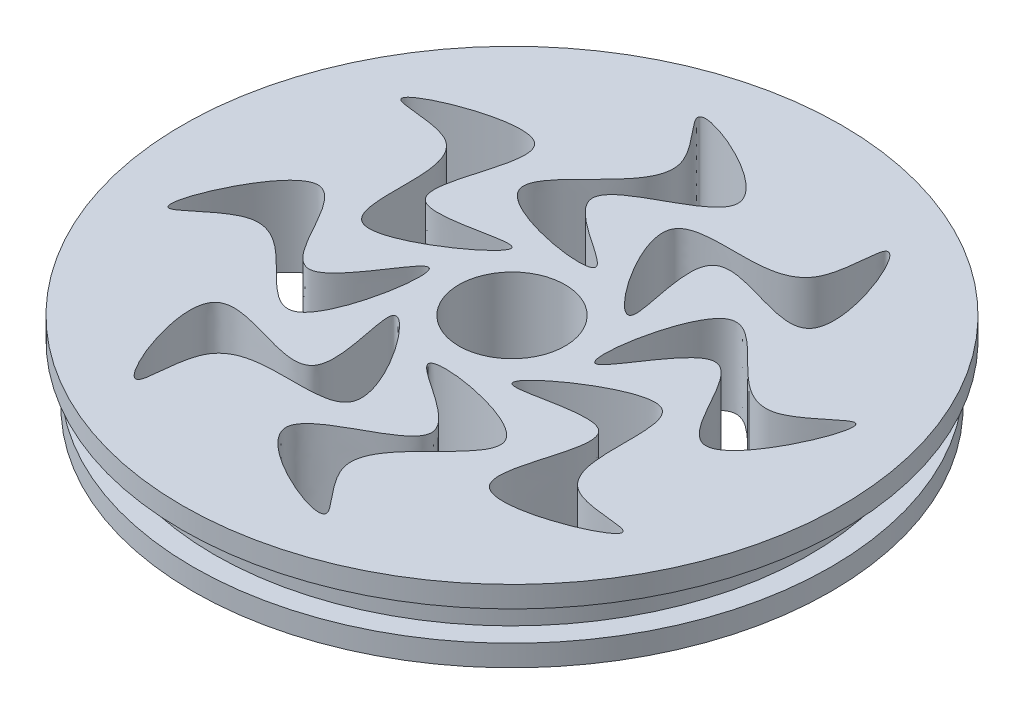
ISO-10303-21;
HEADER;
FILE_DESCRIPTION(('STEP AP214'),'2;1');
FILE_NAME('part.step','',(''),(''),'','','');
FILE_SCHEMA(('AUTOMOTIVE_DESIGN { 1 0 10303 214 1 1 1 1 }'));
ENDSEC;
DATA;
#1=APPLICATION_CONTEXT('core data for automotive mechanical design processes');
#2=APPLICATION_PROTOCOL_DEFINITION('international standard','automotive_design',2000,#1);
#3=PRODUCT_CONTEXT('',#1,'mechanical');
#4=PRODUCT('Part','Part','',(#3));
#5=PRODUCT_RELATED_PRODUCT_CATEGORY('part','',(#4));
#6=PRODUCT_DEFINITION_FORMATION('','',#4);
#7=PRODUCT_DEFINITION_CONTEXT('part definition',#1,'design');
#8=PRODUCT_DEFINITION('design','',#6,#7);
#9=PRODUCT_DEFINITION_SHAPE('','',#8);
#10=(LENGTH_UNIT() NAMED_UNIT(*) SI_UNIT(.MILLI.,.METRE.));
#11=(NAMED_UNIT(*) PLANE_ANGLE_UNIT() SI_UNIT($,.RADIAN.));
#12=(NAMED_UNIT(*) SI_UNIT($,.STERADIAN.) SOLID_ANGLE_UNIT());
#13=UNCERTAINTY_MEASURE_WITH_UNIT(LENGTH_MEASURE(1.E-05),#10,'distance_accuracy_value','');
#14=(GEOMETRIC_REPRESENTATION_CONTEXT(3) GLOBAL_UNCERTAINTY_ASSIGNED_CONTEXT((#13)) GLOBAL_UNIT_ASSIGNED_CONTEXT((#10,
#11,#12)) REPRESENTATION_CONTEXT('',''));
#15=CARTESIAN_POINT('',(0.,0.,0.));
#16=DIRECTION('',(0.,0.,1.));
#17=DIRECTION('',(1.,0.,0.));
#18=AXIS2_PLACEMENT_3D('',#15,#16,#17);
#19=CARTESIAN_POINT('',(0.,7.5,0.));
#20=DIRECTION('',(0.,-1.,0.));
#21=DIRECTION('',(0.,0.,-1.));
#22=AXIS2_PLACEMENT_3D('',#19,#20,#21);
#23=CYLINDRICAL_SURFACE('',#22,28.);
#24=CARTESIAN_POINT('',(0.,2.,0.));
#25=DIRECTION('',(0.,1.,0.));
#26=DIRECTION('',(0.,0.,1.));
#27=AXIS2_PLACEMENT_3D('',#24,#25,#26);
#28=CIRCLE('',#27,28.);
#29=CARTESIAN_POINT('',(0.,2.,28.));
#30=VERTEX_POINT('',#29);
#31=EDGE_CURVE('E46',#30,#30,#28,.T.);
#32=ORIENTED_EDGE('',*,*,#31,.T.);
#33=EDGE_LOOP('',(#32));
#34=FACE_BOUND('',#33,.T.);
#35=CARTESIAN_POINT('',(0.,5.5,0.));
#36=DIRECTION('',(0.,1.,0.));
#37=DIRECTION('',(0.,0.,1.));
#38=AXIS2_PLACEMENT_3D('',#35,#36,#37);
#39=CIRCLE('',#38,28.);
#40=CARTESIAN_POINT('',(0.,5.5,28.));
#41=VERTEX_POINT('',#40);
#42=EDGE_CURVE('E10',#41,#41,#39,.T.);
#43=ORIENTED_EDGE('',*,*,#42,.F.);
#44=EDGE_LOOP('',(#43));
#45=FACE_BOUND('',#44,.T.);
#46=ADVANCED_FACE('F31',(#34,#45),#23,.T.);
#47=CARTESIAN_POINT('',(0.,2.,0.));
#48=DIRECTION('',(0.,1.,0.));
#49=DIRECTION('',(0.,0.,1.));
#50=AXIS2_PLACEMENT_3D('',#47,#48,#49);
#51=PLANE('',#50);
#52=CARTESIAN_POINT('',(0.,2.,0.));
#53=DIRECTION('',(0.,1.,0.));
#54=DIRECTION('',(0.,0.,1.));
#55=AXIS2_PLACEMENT_3D('',#52,#53,#54);
#56=CIRCLE('',#55,30.);
#57=CARTESIAN_POINT('',(0.,2.,30.));
#58=VERTEX_POINT('',#57);
#59=EDGE_CURVE('E37',#58,#58,#56,.T.);
#60=ORIENTED_EDGE('',*,*,#59,.T.);
#61=EDGE_LOOP('',(#60));
#62=FACE_BOUND('',#61,.T.);
#63=ORIENTED_EDGE('',*,*,#31,.F.);
#64=EDGE_LOOP('',(#63));
#65=FACE_BOUND('',#64,.T.);
#66=ADVANCED_FACE('F104',(#62,#65),#51,.T.);
#67=CARTESIAN_POINT('',(0.,2.,0.));
#68=DIRECTION('',(0.,-1.,0.));
#69=DIRECTION('',(0.,0.,-1.));
#70=AXIS2_PLACEMENT_3D('',#67,#68,#69);
#71=CYLINDRICAL_SURFACE('',#70,30.);
#72=ORIENTED_EDGE('',*,*,#59,.F.);
#73=EDGE_LOOP('',(#72));
#74=FACE_BOUND('',#73,.T.);
#75=CARTESIAN_POINT('',(0.,0.,0.));
#76=DIRECTION('',(0.,1.,0.));
#77=DIRECTION('',(0.,0.,1.));
#78=AXIS2_PLACEMENT_3D('',#75,#76,#77);
#79=CIRCLE('',#78,30.);
#80=CARTESIAN_POINT('',(0.,0.,30.));
#81=VERTEX_POINT('',#80);
#82=EDGE_CURVE('E41',#81,#81,#79,.T.);
#83=ORIENTED_EDGE('',*,*,#82,.T.);
#84=EDGE_LOOP('',(#83));
#85=FACE_BOUND('',#84,.T.);
#86=ADVANCED_FACE('F107',(#74,#85),#71,.T.);
#87=CARTESIAN_POINT('',(0.,0.,0.));
#88=DIRECTION('',(0.,1.,0.));
#89=DIRECTION('',(0.,0.,1.));
#90=AXIS2_PLACEMENT_3D('',#87,#88,#89);
#91=PLANE('',#90);
#92=CARTESIAN_POINT('',(5.58240807576075,0.,-5.58240807576064));
#93=CARTESIAN_POINT('',(6.13841421486254,0.,-6.29855762706529));
#94=CARTESIAN_POINT('',(1.44272330335064,0.,-18.7798076566674));
#95=CARTESIAN_POINT('',(20.3043888463129,0.,-6.55030972278273));
#96=CARTESIAN_POINT('',(11.3759242127505,0.,-28.3227114761219));
#97=CARTESIAN_POINT('',(12.3122749286879,0.,-17.0434344720307));
#98=CARTESIAN_POINT('',(6.91772905393557,0.,-15.0295132032876));
#99=CARTESIAN_POINT('',(-4.26828936773424,0.,-17.3332209977019));
#100=CARTESIAN_POINT('',(4.85669662302141,0.,-4.64767391599847));
#101=CARTESIAN_POINT('',(5.58240807576075,0.,-5.58240807576064));
#102=B_SPLINE_CURVE_WITH_KNOTS('',3,(#92,#93,#94,#95,#96,#97,#98,#99,#100,#101),.UNSPECIFIED.,
.T.,.F.,(4,1,1,1,1,1,1,4),(0.,0.142326040113192,0.3221719306217,0.508640424366339,
0.607564134793765,0.674447796623245,0.814232919262293,1.),.UNSPECIFIED.);
#103=CARTESIAN_POINT('',(5.58240807576075,0.,-5.58240807576064));
#104=VERTEX_POINT('',#103);
#105=EDGE_CURVE('E253',#104,#104,#102,.T.);
#106=ORIENTED_EDGE('',*,*,#105,.T.);
#107=EDGE_LOOP('',(#106));
#108=FACE_BOUND('',#107,.T.);
#109=CARTESIAN_POINT('',(0.,0.,-7.89471721144187));
#110=CARTESIAN_POINT('',(-0.113238492730934,0.,-8.79426712685332));
#111=CARTESIAN_POINT('',(-12.2591699122335,0.,-14.2994887745836));
#112=CARTESIAN_POINT('',(9.72560261722451,0.,-18.9891394649282));
#113=CARTESIAN_POINT('',(-11.9831881932558,0.,-28.071174499456));
#114=CARTESIAN_POINT('',(-3.34543499597314,0.,-20.7576211837898));
#115=CARTESIAN_POINT('',(-5.7358975795284,0.,-15.5190438284264));
#116=CARTESIAN_POINT('',(-15.2745744632714,0.,-9.23830175128873));
#117=CARTESIAN_POINT('',(0.147801373557877,0.,-6.72060485905059));
#118=CARTESIAN_POINT('',(0.,0.,-7.89471721144187));
#119=B_SPLINE_CURVE_WITH_KNOTS('',3,(#109,#110,#111,#112,#113,#114,#115,#116,#117,#118),
.UNSPECIFIED.,.T.,.F.,(4,1,1,1,1,1,1,4),(0.,0.142326040113192,0.3221719306217,0.508640424366339,
0.607564134793765,0.674447796623245,0.814232919262293,1.),.UNSPECIFIED.);
#120=CARTESIAN_POINT('',(0.,0.,-7.89471721144187));
#121=VERTEX_POINT('',#120);
#122=EDGE_CURVE('E265',#121,#121,#119,.T.);
#123=ORIENTED_EDGE('',*,*,#122,.T.);
#124=EDGE_LOOP('',(#123));
#125=FACE_BOUND('',#124,.T.);
#126=CARTESIAN_POINT('',(-5.58240807576066,0.,-5.58240807576073));
#127=CARTESIAN_POINT('',(-6.29855762706531,0.,-6.13841421486252));
#128=CARTESIAN_POINT('',(-18.7798076566674,0.,-1.44272330335058));
#129=CARTESIAN_POINT('',(-6.55030972278279,0.,-20.3043888463129));
#130=CARTESIAN_POINT('',(-28.322711476122,0.,-11.3759242127504));
#131=CARTESIAN_POINT('',(-17.0434344720307,0.,-12.3122749286879));
#132=CARTESIAN_POINT('',(-15.0295132032876,0.,-6.91772905393552));
#133=CARTESIAN_POINT('',(-17.3332209977019,0.,4.26828936773429));
#134=CARTESIAN_POINT('',(-4.64767391599848,0.,-4.85669662302139));
#135=CARTESIAN_POINT('',(-5.58240807576066,0.,-5.58240807576073));
#136=B_SPLINE_CURVE_WITH_KNOTS('',3,(#126,#127,#128,#129,#130,#131,#132,#133,#134,#135),
.UNSPECIFIED.,.T.,.F.,(4,1,1,1,1,1,1,4),(0.,0.142326040113192,0.3221719306217,0.508640424366339,
0.607564134793765,0.674447796623245,0.814232919262293,1.),.UNSPECIFIED.);
#137=CARTESIAN_POINT('',(-5.58240807576066,0.,-5.58240807576073));
#138=VERTEX_POINT('',#137);
#139=EDGE_CURVE('E282',#138,#138,#136,.T.);
#140=ORIENTED_EDGE('',*,*,#139,.T.);
#141=EDGE_LOOP('',(#140));
#142=FACE_BOUND('',#141,.T.);
#143=CARTESIAN_POINT('',(-7.89471721144187,0.,0.));
#144=CARTESIAN_POINT('',(-8.79426712685332,0.,0.113238492730957));
#145=CARTESIAN_POINT('',(-14.2994887745836,0.,12.2591699122335));
#146=CARTESIAN_POINT('',(-18.9891394649283,0.,-9.72560261722446));
#147=CARTESIAN_POINT('',(-28.0711744994559,0.,11.9831881932559));
#148=CARTESIAN_POINT('',(-20.7576211837898,0.,3.34543499597319));
#149=CARTESIAN_POINT('',(-15.5190438284264,0.,5.73589757952844));
#150=CARTESIAN_POINT('',(-9.23830175128868,0.,15.2745744632714));
#151=CARTESIAN_POINT('',(-6.72060485905059,0.,-0.147801373557859));
#152=CARTESIAN_POINT('',(-7.89471721144187,0.,0.));
#153=B_SPLINE_CURVE_WITH_KNOTS('',3,(#143,#144,#145,#146,#147,#148,#149,#150,#151,#152),
.UNSPECIFIED.,.T.,.F.,(4,1,1,1,1,1,1,4),(0.,0.142326040113192,0.3221719306217,0.508640424366339,
0.607564134793765,0.674447796623245,0.814232919262293,1.),.UNSPECIFIED.);
#154=CARTESIAN_POINT('',(-7.89471721144187,0.,0.));
#155=VERTEX_POINT('',#154);
#156=EDGE_CURVE('E299',#155,#155,#153,.T.);
#157=ORIENTED_EDGE('',*,*,#156,.T.);
#158=EDGE_LOOP('',(#157));
#159=FACE_BOUND('',#158,.T.);
#160=CARTESIAN_POINT('',(-5.58240807576072,0.,5.58240807576068));
#161=CARTESIAN_POINT('',(-6.13841421486251,0.,6.29855762706533));
#162=CARTESIAN_POINT('',(-1.44272330335053,0.,18.7798076566674));
#163=CARTESIAN_POINT('',(-20.3043888463129,0.,6.55030972278285));
#164=CARTESIAN_POINT('',(-11.3759242127503,0.,28.322711476122));
#165=CARTESIAN_POINT('',(-12.3122749286878,0.,17.0434344720308));
#166=CARTESIAN_POINT('',(-6.91772905393548,0.,15.0295132032876));
#167=CARTESIAN_POINT('',(4.26828936773434,0.,17.3332209977019));
#168=CARTESIAN_POINT('',(-4.85669662302138,0.,4.6476739159985));
#169=CARTESIAN_POINT('',(-5.58240807576072,0.,5.58240807576068));
#170=B_SPLINE_CURVE_WITH_KNOTS('',3,(#160,#161,#162,#163,#164,#165,#166,#167,#168,#169),
.UNSPECIFIED.,.T.,.F.,(4,1,1,1,1,1,1,4),(0.,0.142326040113192,0.3221719306217,0.508640424366339,
0.607564134793765,0.674447796623245,0.814232919262293,1.),.UNSPECIFIED.);
#171=CARTESIAN_POINT('',(-5.58240807576072,0.,5.58240807576068));
#172=VERTEX_POINT('',#171);
#173=EDGE_CURVE('E312',#172,#172,#170,.T.);
#174=ORIENTED_EDGE('',*,*,#173,.T.);
#175=EDGE_LOOP('',(#174));
#176=FACE_BOUND('',#175,.T.);
#177=CARTESIAN_POINT('',(0.,0.,7.89471721144187));
#178=CARTESIAN_POINT('',(0.113238492730979,0.,8.79426712685332));
#179=CARTESIAN_POINT('',(12.2591699122335,0.,14.2994887745835));
#180=CARTESIAN_POINT('',(-9.72560261722441,0.,18.9891394649283));
#181=CARTESIAN_POINT('',(11.9831881932559,0.,28.0711744994559));
#182=CARTESIAN_POINT('',(3.34543499597325,0.,20.7576211837898));
#183=CARTESIAN_POINT('',(5.73589757952848,0.,15.5190438284264));
#184=CARTESIAN_POINT('',(15.2745744632715,0.,9.23830175128865));
#185=CARTESIAN_POINT('',(-0.147801373557841,0.,6.72060485905059));
#186=CARTESIAN_POINT('',(0.,0.,7.89471721144187));
#187=B_SPLINE_CURVE_WITH_KNOTS('',3,(#177,#178,#179,#180,#181,#182,#183,#184,#185,#186),
.UNSPECIFIED.,.T.,.F.,(4,1,1,1,1,1,1,4),(0.,0.142326040113192,0.3221719306217,0.508640424366339,
0.607564134793765,0.674447796623245,0.814232919262293,1.),.UNSPECIFIED.);
#188=CARTESIAN_POINT('',(0.,0.,7.89471721144187));
#189=VERTEX_POINT('',#188);
#190=EDGE_CURVE('E329',#189,#189,#187,.T.);
#191=ORIENTED_EDGE('',*,*,#190,.T.);
#192=EDGE_LOOP('',(#191));
#193=FACE_BOUND('',#192,.T.);
#194=CARTESIAN_POINT('',(5.58240807576069,0.,5.5824080757607));
#195=CARTESIAN_POINT('',(6.29855762706534,0.,6.13841421486249));
#196=CARTESIAN_POINT('',(18.7798076566674,0.,1.44272330335049));
#197=CARTESIAN_POINT('',(6.5503097227829,0.,20.3043888463129));
#198=CARTESIAN_POINT('',(28.322711476122,0.,11.3759242127503));
#199=CARTESIAN_POINT('',(17.0434344720308,0.,12.3122749286878));
#200=CARTESIAN_POINT('',(15.0295132032877,0.,6.91772905393545));
#201=CARTESIAN_POINT('',(17.3332209977019,0.,-4.26828936773438));
#202=CARTESIAN_POINT('',(4.64767391599851,0.,4.85669662302137));
#203=CARTESIAN_POINT('',(5.58240807576069,0.,5.5824080757607));
#204=B_SPLINE_CURVE_WITH_KNOTS('',3,(#194,#195,#196,#197,#198,#199,#200,#201,#202,#203),
.UNSPECIFIED.,.T.,.F.,(4,1,1,1,1,1,1,4),(0.,0.142326040113192,0.3221719306217,0.508640424366339,
0.607564134793765,0.674447796623245,0.814232919262293,1.),.UNSPECIFIED.);
#205=CARTESIAN_POINT('',(5.58240807576069,0.,5.5824080757607));
#206=VERTEX_POINT('',#205);
#207=EDGE_CURVE('E345',#206,#206,#204,.T.);
#208=ORIENTED_EDGE('',*,*,#207,.T.);
#209=EDGE_LOOP('',(#208));
#210=FACE_BOUND('',#209,.T.);
#211=CARTESIAN_POINT('',(7.89471721144187,0.,0.));
#212=CARTESIAN_POINT('',(8.79426712685332,0.,-0.113238492731003));
#213=CARTESIAN_POINT('',(14.2994887745835,0.,-12.2591699122336));
#214=CARTESIAN_POINT('',(18.9891394649283,0.,9.72560261722436));
#215=CARTESIAN_POINT('',(28.0711744994559,0.,-11.983188193256));
#216=CARTESIAN_POINT('',(20.7576211837898,0.,-3.3454349959733));
#217=CARTESIAN_POINT('',(15.5190438284264,0.,-5.73589757952852));
#218=CARTESIAN_POINT('',(9.2383017512886,0.,-15.2745744632715));
#219=CARTESIAN_POINT('',(6.7206048590506,0.,0.147801373557824));
#220=CARTESIAN_POINT('',(7.89471721144187,0.,0.));
#221=B_SPLINE_CURVE_WITH_KNOTS('',3,(#211,#212,#213,#214,#215,#216,#217,#218,#219,#220),
.UNSPECIFIED.,.T.,.F.,(4,1,1,1,1,1,1,4),(0.,0.142326040113192,0.3221719306217,0.508640424366339,
0.607564134793765,0.674447796623245,0.814232919262293,1.),.UNSPECIFIED.);
#222=CARTESIAN_POINT('',(7.89471721144187,0.,0.));
#223=VERTEX_POINT('',#222);
#224=EDGE_CURVE('E60',#223,#223,#221,.T.);
#225=ORIENTED_EDGE('',*,*,#224,.T.);
#226=EDGE_LOOP('',(#225));
#227=FACE_BOUND('',#226,.T.);
#228=CARTESIAN_POINT('',(0.,0.,0.));
#229=DIRECTION('',(0.,1.,0.));
#230=DIRECTION('',(0.,0.,1.));
#231=AXIS2_PLACEMENT_3D('',#228,#229,#230);
#232=CIRCLE('',#231,5.);
#233=CARTESIAN_POINT('',(0.,0.,5.));
#234=VERTEX_POINT('',#233);
#235=EDGE_CURVE('E54',#234,#234,#232,.T.);
#236=ORIENTED_EDGE('',*,*,#235,.T.);
#237=EDGE_LOOP('',(#236));
#238=FACE_BOUND('',#237,.T.);
#239=ORIENTED_EDGE('',*,*,#82,.F.);
#240=EDGE_LOOP('',(#239));
#241=FACE_BOUND('',#240,.T.);
#242=ADVANCED_FACE('F102',(#108,#125,#142,#159,#176,#193,#210,#227,#238,#241),#91,.F.);
#243=CARTESIAN_POINT('',(0.,5.5,0.));
#244=DIRECTION('',(0.,1.,0.));
#245=DIRECTION('',(0.,0.,1.));
#246=AXIS2_PLACEMENT_3D('',#243,#244,#245);
#247=CYLINDRICAL_SURFACE('',#246,31.);
#248=CARTESIAN_POINT('',(0.,5.5,0.));
#249=DIRECTION('',(0.,1.,0.));
#250=DIRECTION('',(0.,0.,1.));
#251=AXIS2_PLACEMENT_3D('',#248,#249,#250);
#252=CIRCLE('',#251,31.);
#253=CARTESIAN_POINT('',(0.,5.5,31.));
#254=VERTEX_POINT('',#253);
#255=EDGE_CURVE('E50',#254,#254,#252,.T.);
#256=ORIENTED_EDGE('',*,*,#255,.T.);
#257=EDGE_LOOP('',(#256));
#258=FACE_BOUND('',#257,.T.);
#259=CARTESIAN_POINT('',(0.,7.5,0.));
#260=DIRECTION('',(0.,1.,0.));
#261=DIRECTION('',(0.,0.,1.));
#262=AXIS2_PLACEMENT_3D('',#259,#260,#261);
#263=CIRCLE('',#262,31.);
#264=CARTESIAN_POINT('',(0.,7.5,31.));
#265=VERTEX_POINT('',#264);
#266=EDGE_CURVE('E51',#265,#265,#263,.T.);
#267=ORIENTED_EDGE('',*,*,#266,.F.);
#268=EDGE_LOOP('',(#267));
#269=FACE_BOUND('',#268,.T.);
#270=ADVANCED_FACE('F99',(#258,#269),#247,.T.);
#271=CARTESIAN_POINT('',(0.,5.5,0.));
#272=DIRECTION('',(0.,1.,0.));
#273=DIRECTION('',(0.,0.,1.));
#274=AXIS2_PLACEMENT_3D('',#271,#272,#273);
#275=PLANE('',#274);
#276=ORIENTED_EDGE('',*,*,#42,.T.);
#277=EDGE_LOOP('',(#276));
#278=FACE_BOUND('',#277,.T.);
#279=ORIENTED_EDGE('',*,*,#255,.F.);
#280=EDGE_LOOP('',(#279));
#281=FACE_BOUND('',#280,.T.);
#282=ADVANCED_FACE('F96',(#278,#281),#275,.F.);
#283=CARTESIAN_POINT('',(0.,7.5,0.));
#284=DIRECTION('',(0.,1.,0.));
#285=DIRECTION('',(0.,0.,1.));
#286=AXIS2_PLACEMENT_3D('',#283,#284,#285);
#287=PLANE('',#286);
#288=CARTESIAN_POINT('',(5.58240807576075,7.5,-5.58240807576064));
#289=CARTESIAN_POINT('',(6.13841421486254,7.5,-6.29855762706529));
#290=CARTESIAN_POINT('',(1.44272330335064,7.5,-18.7798076566674));
#291=CARTESIAN_POINT('',(20.3043888463129,7.5,-6.55030972278273));
#292=CARTESIAN_POINT('',(11.3759242127505,7.5,-28.3227114761219));
#293=CARTESIAN_POINT('',(12.3122749286879,7.5,-17.0434344720307));
#294=CARTESIAN_POINT('',(6.91772905393557,7.5,-15.0295132032876));
#295=CARTESIAN_POINT('',(-4.26828936773424,7.5,-17.3332209977019));
#296=CARTESIAN_POINT('',(4.85669662302141,7.5,-4.64767391599847));
#297=CARTESIAN_POINT('',(5.58240807576075,7.5,-5.58240807576064));
#298=B_SPLINE_CURVE_WITH_KNOTS('',3,(#288,#289,#290,#291,#292,#293,#294,#295,#296,#297),
.UNSPECIFIED.,.T.,.F.,(4,1,1,1,1,1,1,4),(0.,0.142326040113192,0.3221719306217,0.508640424366339,
0.607564134793765,0.674447796623245,0.814232919262293,1.),.UNSPECIFIED.);
#299=CARTESIAN_POINT('',(5.58240807576075,7.5,-5.58240807576064));
#300=VERTEX_POINT('',#299);
#301=EDGE_CURVE('E258',#300,#300,#298,.T.);
#302=ORIENTED_EDGE('',*,*,#301,.F.);
#303=EDGE_LOOP('',(#302));
#304=FACE_BOUND('',#303,.T.);
#305=CARTESIAN_POINT('',(0.,7.5,-7.89471721144187));
#306=CARTESIAN_POINT('',(-0.113238492730934,7.5,-8.79426712685332));
#307=CARTESIAN_POINT('',(-12.2591699122335,7.5,-14.2994887745836));
#308=CARTESIAN_POINT('',(9.72560261722451,7.5,-18.9891394649282));
#309=CARTESIAN_POINT('',(-11.9831881932558,7.5,-28.071174499456));
#310=CARTESIAN_POINT('',(-3.34543499597314,7.5,-20.7576211837898));
#311=CARTESIAN_POINT('',(-5.7358975795284,7.5,-15.5190438284264));
#312=CARTESIAN_POINT('',(-15.2745744632714,7.5,-9.23830175128873));
#313=CARTESIAN_POINT('',(0.147801373557877,7.5,-6.72060485905059));
#314=CARTESIAN_POINT('',(0.,7.5,-7.89471721144187));
#315=B_SPLINE_CURVE_WITH_KNOTS('',3,(#305,#306,#307,#308,#309,#310,#311,#312,#313,#314),
.UNSPECIFIED.,.T.,.F.,(4,1,1,1,1,1,1,4),(0.,0.142326040113192,0.3221719306217,0.508640424366339,
0.607564134793765,0.674447796623245,0.814232919262293,1.),.UNSPECIFIED.);
#316=CARTESIAN_POINT('',(0.,7.5,-7.89471721144187));
#317=VERTEX_POINT('',#316);
#318=EDGE_CURVE('E274',#317,#317,#315,.T.);
#319=ORIENTED_EDGE('',*,*,#318,.F.);
#320=EDGE_LOOP('',(#319));
#321=FACE_BOUND('',#320,.T.);
#322=CARTESIAN_POINT('',(-5.58240807576066,7.5,-5.58240807576073));
#323=CARTESIAN_POINT('',(-6.29855762706531,7.5,-6.13841421486252));
#324=CARTESIAN_POINT('',(-18.7798076566674,7.5,-1.44272330335058));
#325=CARTESIAN_POINT('',(-6.55030972278279,7.5,-20.3043888463129));
#326=CARTESIAN_POINT('',(-28.322711476122,7.5,-11.3759242127504));
#327=CARTESIAN_POINT('',(-17.0434344720307,7.5,-12.3122749286879));
#328=CARTESIAN_POINT('',(-15.0295132032876,7.5,-6.91772905393552));
#329=CARTESIAN_POINT('',(-17.3332209977019,7.5,4.26828936773429));
#330=CARTESIAN_POINT('',(-4.64767391599848,7.5,-4.85669662302139));
#331=CARTESIAN_POINT('',(-5.58240807576066,7.5,-5.58240807576073));
#332=B_SPLINE_CURVE_WITH_KNOTS('',3,(#322,#323,#324,#325,#326,#327,#328,#329,#330,#331),
.UNSPECIFIED.,.T.,.F.,(4,1,1,1,1,1,1,4),(0.,0.142326040113192,0.3221719306217,0.508640424366339,
0.607564134793765,0.674447796623245,0.814232919262293,1.),.UNSPECIFIED.);
#333=CARTESIAN_POINT('',(-5.58240807576066,7.5,-5.58240807576073));
#334=VERTEX_POINT('',#333);
#335=EDGE_CURVE('E291',#334,#334,#332,.T.);
#336=ORIENTED_EDGE('',*,*,#335,.F.);
#337=EDGE_LOOP('',(#336));
#338=FACE_BOUND('',#337,.T.);
#339=CARTESIAN_POINT('',(-7.89471721144187,7.5,0.));
#340=CARTESIAN_POINT('',(-8.79426712685332,7.5,0.113238492730957));
#341=CARTESIAN_POINT('',(-14.2994887745836,7.5,12.2591699122335));
#342=CARTESIAN_POINT('',(-18.9891394649283,7.5,-9.72560261722446));
#343=CARTESIAN_POINT('',(-28.0711744994559,7.5,11.9831881932559));
#344=CARTESIAN_POINT('',(-20.7576211837898,7.5,3.34543499597319));
#345=CARTESIAN_POINT('',(-15.5190438284264,7.5,5.73589757952844));
#346=CARTESIAN_POINT('',(-9.23830175128868,7.5,15.2745744632714));
#347=CARTESIAN_POINT('',(-6.72060485905059,7.5,-0.147801373557859));
#348=CARTESIAN_POINT('',(-7.89471721144187,7.5,0.));
#349=B_SPLINE_CURVE_WITH_KNOTS('',3,(#339,#340,#341,#342,#343,#344,#345,#346,#347,#348),
.UNSPECIFIED.,.T.,.F.,(4,1,1,1,1,1,1,4),(0.,0.142326040113192,0.3221719306217,0.508640424366339,
0.607564134793765,0.674447796623245,0.814232919262293,1.),.UNSPECIFIED.);
#350=CARTESIAN_POINT('',(-7.89471721144187,7.5,0.));
#351=VERTEX_POINT('',#350);
#352=EDGE_CURVE('E305',#351,#351,#349,.T.);
#353=ORIENTED_EDGE('',*,*,#352,.F.);
#354=EDGE_LOOP('',(#353));
#355=FACE_BOUND('',#354,.T.);
#356=CARTESIAN_POINT('',(-5.58240807576072,7.5,5.58240807576068));
#357=CARTESIAN_POINT('',(-6.13841421486251,7.5,6.29855762706533));
#358=CARTESIAN_POINT('',(-1.44272330335053,7.5,18.7798076566674));
#359=CARTESIAN_POINT('',(-20.3043888463129,7.5,6.55030972278285));
#360=CARTESIAN_POINT('',(-11.3759242127503,7.5,28.322711476122));
#361=CARTESIAN_POINT('',(-12.3122749286878,7.5,17.0434344720308));
#362=CARTESIAN_POINT('',(-6.91772905393548,7.5,15.0295132032876));
#363=CARTESIAN_POINT('',(4.26828936773434,7.5,17.3332209977019));
#364=CARTESIAN_POINT('',(-4.85669662302138,7.5,4.6476739159985));
#365=CARTESIAN_POINT('',(-5.58240807576072,7.5,5.58240807576068));
#366=B_SPLINE_CURVE_WITH_KNOTS('',3,(#356,#357,#358,#359,#360,#361,#362,#363,#364,#365),
.UNSPECIFIED.,.T.,.F.,(4,1,1,1,1,1,1,4),(0.,0.142326040113192,0.3221719306217,0.508640424366339,
0.607564134793765,0.674447796623245,0.814232919262293,1.),.UNSPECIFIED.);
#367=CARTESIAN_POINT('',(-5.58240807576072,7.5,5.58240807576068));
#368=VERTEX_POINT('',#367);
#369=EDGE_CURVE('E321',#368,#368,#366,.T.);
#370=ORIENTED_EDGE('',*,*,#369,.F.);
#371=EDGE_LOOP('',(#370));
#372=FACE_BOUND('',#371,.T.);
#373=CARTESIAN_POINT('',(0.,7.5,7.89471721144187));
#374=CARTESIAN_POINT('',(0.113238492730979,7.5,8.79426712685332));
#375=CARTESIAN_POINT('',(12.2591699122335,7.5,14.2994887745835));
#376=CARTESIAN_POINT('',(-9.72560261722441,7.5,18.9891394649283));
#377=CARTESIAN_POINT('',(11.9831881932559,7.5,28.0711744994559));
#378=CARTESIAN_POINT('',(3.34543499597325,7.5,20.7576211837898));
#379=CARTESIAN_POINT('',(5.73589757952848,7.5,15.5190438284264));
#380=CARTESIAN_POINT('',(15.2745744632715,7.5,9.23830175128865));
#381=CARTESIAN_POINT('',(-0.147801373557841,7.5,6.72060485905059));
#382=CARTESIAN_POINT('',(0.,7.5,7.89471721144187));
#383=B_SPLINE_CURVE_WITH_KNOTS('',3,(#373,#374,#375,#376,#377,#378,#379,#380,#381,#382),
.UNSPECIFIED.,.T.,.F.,(4,1,1,1,1,1,1,4),(0.,0.142326040113192,0.3221719306217,0.508640424366339,
0.607564134793765,0.674447796623245,0.814232919262293,1.),.UNSPECIFIED.);
#384=CARTESIAN_POINT('',(0.,7.5,7.89471721144187));
#385=VERTEX_POINT('',#384);
#386=EDGE_CURVE('E338',#385,#385,#383,.T.);
#387=ORIENTED_EDGE('',*,*,#386,.F.);
#388=EDGE_LOOP('',(#387));
#389=FACE_BOUND('',#388,.T.);
#390=CARTESIAN_POINT('',(5.58240807576069,7.5,5.5824080757607));
#391=CARTESIAN_POINT('',(6.29855762706534,7.5,6.13841421486249));
#392=CARTESIAN_POINT('',(18.7798076566674,7.5,1.44272330335049));
#393=CARTESIAN_POINT('',(6.5503097227829,7.5,20.3043888463129));
#394=CARTESIAN_POINT('',(28.322711476122,7.5,11.3759242127503));
#395=CARTESIAN_POINT('',(17.0434344720308,7.5,12.3122749286878));
#396=CARTESIAN_POINT('',(15.0295132032877,7.5,6.91772905393545));
#397=CARTESIAN_POINT('',(17.3332209977019,7.5,-4.26828936773438));
#398=CARTESIAN_POINT('',(4.64767391599851,7.5,4.85669662302137));
#399=CARTESIAN_POINT('',(5.58240807576069,7.5,5.5824080757607));
#400=B_SPLINE_CURVE_WITH_KNOTS('',3,(#390,#391,#392,#393,#394,#395,#396,#397,#398,#399),
.UNSPECIFIED.,.T.,.F.,(4,1,1,1,1,1,1,4),(0.,0.142326040113192,0.3221719306217,0.508640424366339,
0.607564134793765,0.674447796623245,0.814232919262293,1.),.UNSPECIFIED.);
#401=CARTESIAN_POINT('',(5.58240807576069,7.5,5.5824080757607));
#402=VERTEX_POINT('',#401);
#403=EDGE_CURVE('E68',#402,#402,#400,.T.);
#404=ORIENTED_EDGE('',*,*,#403,.F.);
#405=EDGE_LOOP('',(#404));
#406=FACE_BOUND('',#405,.T.);
#407=CARTESIAN_POINT('',(7.89471721144187,7.5,0.));
#408=CARTESIAN_POINT('',(8.79426712685332,7.5,-0.113238492731003));
#409=CARTESIAN_POINT('',(14.2994887745835,7.5,-12.2591699122336));
#410=CARTESIAN_POINT('',(18.9891394649283,7.5,9.72560261722436));
#411=CARTESIAN_POINT('',(28.0711744994559,7.5,-11.983188193256));
#412=CARTESIAN_POINT('',(20.7576211837898,7.5,-3.3454349959733));
#413=CARTESIAN_POINT('',(15.5190438284264,7.5,-5.73589757952852));
#414=CARTESIAN_POINT('',(9.2383017512886,7.5,-15.2745744632715));
#415=CARTESIAN_POINT('',(6.7206048590506,7.5,0.147801373557824));
#416=CARTESIAN_POINT('',(7.89471721144187,7.5,0.));
#417=B_SPLINE_CURVE_WITH_KNOTS('',3,(#407,#408,#409,#410,#411,#412,#413,#414,#415,#416),
.UNSPECIFIED.,.T.,.F.,(4,1,1,1,1,1,1,4),(0.,0.142326040113192,0.3221719306217,0.508640424366339,
0.607564134793765,0.674447796623245,0.814232919262293,1.),.UNSPECIFIED.);
#418=CARTESIAN_POINT('',(7.89471721144187,7.5,0.));
#419=VERTEX_POINT('',#418);
#420=EDGE_CURVE('E63',#419,#419,#417,.T.);
#421=ORIENTED_EDGE('',*,*,#420,.F.);
#422=EDGE_LOOP('',(#421));
#423=FACE_BOUND('',#422,.T.);
#424=CARTESIAN_POINT('',(0.,7.5,0.));
#425=DIRECTION('',(0.,1.,0.));
#426=DIRECTION('',(0.,0.,1.));
#427=AXIS2_PLACEMENT_3D('',#424,#425,#426);
#428=CIRCLE('',#427,5.);
#429=CARTESIAN_POINT('',(0.,7.5,5.));
#430=VERTEX_POINT('',#429);
#431=EDGE_CURVE('E57',#430,#430,#428,.T.);
#432=ORIENTED_EDGE('',*,*,#431,.F.);
#433=EDGE_LOOP('',(#432));
#434=FACE_BOUND('',#433,.T.);
#435=ORIENTED_EDGE('',*,*,#266,.T.);
#436=EDGE_LOOP('',(#435));
#437=FACE_BOUND('',#436,.T.);
#438=ADVANCED_FACE('F94',(#304,#321,#338,#355,#372,#389,#406,#423,#434,#437),#287,.T.);
#439=CARTESIAN_POINT('',(0.,0.,0.));
#440=DIRECTION('',(0.,1.,0.));
#441=DIRECTION('',(0.,0.,1.));
#442=AXIS2_PLACEMENT_3D('',#439,#440,#441);
#443=CYLINDRICAL_SURFACE('',#442,5.);
#444=ORIENTED_EDGE('',*,*,#235,.F.);
#445=EDGE_LOOP('',(#444));
#446=FACE_BOUND('',#445,.T.);
#447=ORIENTED_EDGE('',*,*,#431,.T.);
#448=EDGE_LOOP('',(#447));
#449=FACE_BOUND('',#448,.T.);
#450=ADVANCED_FACE('F89',(#446,#449),#443,.F.);
#451=DIRECTION('',(0.,1.,0.));
#452=VECTOR('',#451,1.);
#453=SURFACE_OF_LINEAR_EXTRUSION('',#221,#452);
#454=ORIENTED_EDGE('',*,*,#224,.F.);
#455=EDGE_LOOP('',(#454));
#456=FACE_BOUND('',#455,.T.);
#457=ORIENTED_EDGE('',*,*,#420,.T.);
#458=EDGE_LOOP('',(#457));
#459=FACE_BOUND('',#458,.T.);
#460=ADVANCED_FACE('F84',(#456,#459),#453,.F.);
#461=DIRECTION('',(0.,1.,0.));
#462=VECTOR('',#461,1.);
#463=SURFACE_OF_LINEAR_EXTRUSION('',#204,#462);
#464=ORIENTED_EDGE('',*,*,#207,.F.);
#465=EDGE_LOOP('',(#464));
#466=FACE_BOUND('',#465,.T.);
#467=ORIENTED_EDGE('',*,*,#403,.T.);
#468=EDGE_LOOP('',(#467));
#469=FACE_BOUND('',#468,.T.);
#470=ADVANCED_FACE('F88',(#466,#469),#463,.F.);
#471=DIRECTION('',(0.,1.,0.));
#472=VECTOR('',#471,1.);
#473=SURFACE_OF_LINEAR_EXTRUSION('',#187,#472);
#474=ORIENTED_EDGE('',*,*,#190,.F.);
#475=EDGE_LOOP('',(#474));
#476=FACE_BOUND('',#475,.T.);
#477=ORIENTED_EDGE('',*,*,#386,.T.);
#478=EDGE_LOOP('',(#477));
#479=FACE_BOUND('',#478,.T.);
#480=ADVANCED_FACE('F183',(#476,#479),#473,.F.);
#481=DIRECTION('',(0.,1.,0.));
#482=VECTOR('',#481,1.);
#483=SURFACE_OF_LINEAR_EXTRUSION('',#170,#482);
#484=ORIENTED_EDGE('',*,*,#173,.F.);
#485=EDGE_LOOP('',(#484));
#486=FACE_BOUND('',#485,.T.);
#487=ORIENTED_EDGE('',*,*,#369,.T.);
#488=EDGE_LOOP('',(#487));
#489=FACE_BOUND('',#488,.T.);
#490=ADVANCED_FACE('F191',(#486,#489),#483,.F.);
#491=DIRECTION('',(0.,1.,0.));
#492=VECTOR('',#491,1.);
#493=SURFACE_OF_LINEAR_EXTRUSION('',#153,#492);
#494=ORIENTED_EDGE('',*,*,#156,.F.);
#495=EDGE_LOOP('',(#494));
#496=FACE_BOUND('',#495,.T.);
#497=ORIENTED_EDGE('',*,*,#352,.T.);
#498=EDGE_LOOP('',(#497));
#499=FACE_BOUND('',#498,.T.);
#500=ADVANCED_FACE('F199',(#496,#499),#493,.F.);
#501=DIRECTION('',(0.,1.,0.));
#502=VECTOR('',#501,1.);
#503=SURFACE_OF_LINEAR_EXTRUSION('',#136,#502);
#504=ORIENTED_EDGE('',*,*,#139,.F.);
#505=EDGE_LOOP('',(#504));
#506=FACE_BOUND('',#505,.T.);
#507=ORIENTED_EDGE('',*,*,#335,.T.);
#508=EDGE_LOOP('',(#507));
#509=FACE_BOUND('',#508,.T.);
#510=ADVANCED_FACE('F208',(#506,#509),#503,.F.);
#511=DIRECTION('',(0.,1.,0.));
#512=VECTOR('',#511,1.);
#513=SURFACE_OF_LINEAR_EXTRUSION('',#119,#512);
#514=ORIENTED_EDGE('',*,*,#122,.F.);
#515=EDGE_LOOP('',(#514));
#516=FACE_BOUND('',#515,.T.);
#517=ORIENTED_EDGE('',*,*,#318,.T.);
#518=EDGE_LOOP('',(#517));
#519=FACE_BOUND('',#518,.T.);
#520=ADVANCED_FACE('F217',(#516,#519),#513,.F.);
#521=DIRECTION('',(0.,1.,0.));
#522=VECTOR('',#521,1.);
#523=SURFACE_OF_LINEAR_EXTRUSION('',#102,#522);
#524=ORIENTED_EDGE('',*,*,#105,.F.);
#525=EDGE_LOOP('',(#524));
#526=FACE_BOUND('',#525,.T.);
#527=ORIENTED_EDGE('',*,*,#301,.T.);
#528=EDGE_LOOP('',(#527));
#529=FACE_BOUND('',#528,.T.);
#530=ADVANCED_FACE('F226',(#526,#529),#523,.F.);
#531=CLOSED_SHELL('',(#46,#66,#86,#242,#270,#282,#438,#450,#460,#470,#480,#490,#500,#510,#520,#530));
#532=MANIFOLD_SOLID_BREP('B2',#531);
#533=ADVANCED_BREP_SHAPE_REPRESENTATION('',(#18,#532),#14);
#534=SHAPE_DEFINITION_REPRESENTATION(#9,#533);
ENDSEC;
END-ISO-10303-21;
